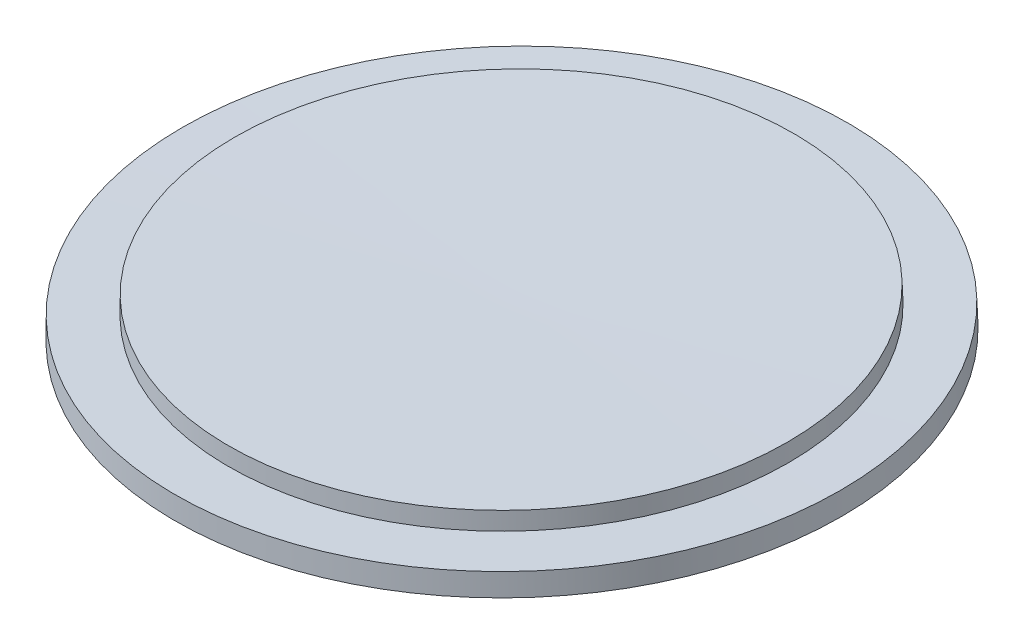
ISO-10303-21;
HEADER;
FILE_DESCRIPTION(('STEP AP214'),'2;1');
FILE_NAME('part.step','',(''),(''),'','','');
FILE_SCHEMA(('AUTOMOTIVE_DESIGN { 1 0 10303 214 1 1 1 1 }'));
ENDSEC;
DATA;
#1=APPLICATION_CONTEXT('core data for automotive mechanical design processes');
#2=APPLICATION_PROTOCOL_DEFINITION('international standard','automotive_design',2000,#1);
#3=PRODUCT_CONTEXT('',#1,'mechanical');
#4=PRODUCT('Part','Part','',(#3));
#5=PRODUCT_RELATED_PRODUCT_CATEGORY('part','',(#4));
#6=PRODUCT_DEFINITION_FORMATION('','',#4);
#7=PRODUCT_DEFINITION_CONTEXT('part definition',#1,'design');
#8=PRODUCT_DEFINITION('design','',#6,#7);
#9=PRODUCT_DEFINITION_SHAPE('','',#8);
#10=(LENGTH_UNIT() NAMED_UNIT(*) SI_UNIT(.MILLI.,.METRE.));
#11=(NAMED_UNIT(*) PLANE_ANGLE_UNIT() SI_UNIT($,.RADIAN.));
#12=(NAMED_UNIT(*) SI_UNIT($,.STERADIAN.) SOLID_ANGLE_UNIT());
#13=UNCERTAINTY_MEASURE_WITH_UNIT(LENGTH_MEASURE(1.E-05),#10,'distance_accuracy_value','');
#14=(GEOMETRIC_REPRESENTATION_CONTEXT(3) GLOBAL_UNCERTAINTY_ASSIGNED_CONTEXT((#13)) GLOBAL_UNIT_ASSIGNED_CONTEXT((#10,
#11,#12)) REPRESENTATION_CONTEXT('',''));
#15=CARTESIAN_POINT('',(0.,0.,0.));
#16=DIRECTION('',(0.,0.,1.));
#17=DIRECTION('',(1.,0.,0.));
#18=AXIS2_PLACEMENT_3D('',#15,#16,#17);
#19=CARTESIAN_POINT('',(608.159806789063,13.3703883650292,0.));
#20=DIRECTION('',(-0.0222407262017592,0.999752644456627,0.));
#21=DIRECTION('',(-0.999752644456627,-0.0222407262017592,0.));
#22=AXIS2_PLACEMENT_3D('',#19,#20,#21);
#23=CONICAL_SURFACE('',#22,601.166897327824,1.54855376662271);
#24=CARTESIAN_POINT('',(608.457247509512,0.,0.));
#25=VERTEX_POINT('',#24);
#26=VERTEX_LOOP('',#25);
#27=FACE_BOUND('',#26,.T.);
#28=CARTESIAN_POINT('',(608.159806789063,13.3703883650292,0.));
#29=DIRECTION('',(0.0222407262017592,-0.999752644456627,0.));
#30=DIRECTION('',(0.999752644456627,0.0222407262017592,0.));
#31=AXIS2_PLACEMENT_3D('',#28,#29,#30);
#32=CIRCLE('',#31,601.166897327824);
#33=CARTESIAN_POINT('',(1209.17800215234,26.7407767300585,0.));
#34=VERTEX_POINT('',#33);
#35=EDGE_CURVE('E67',#34,#34,#32,.T.);
#36=ORIENTED_EDGE('',*,*,#35,.T.);
#37=EDGE_LOOP('',(#36));
#38=FACE_BOUND('',#37,.T.);
#39=ADVANCED_FACE('F49',(#27,#38),#23,.T.);
#40=CARTESIAN_POINT('',(606.590384962578,83.9181576718018,0.));
#41=DIRECTION('',(-0.0222407262017592,0.999752644456627,0.));
#42=DIRECTION('',(-0.999752644456627,-0.0222407262017592,0.));
#43=AXIS2_PLACEMENT_3D('',#40,#41,#42);
#44=CONICAL_SURFACE('',#43,504.310439497787,1.54855376662271);
#45=CARTESIAN_POINT('',(606.839903791909,72.7019272662426,0.));
#46=VERTEX_POINT('',#45);
#47=VERTEX_LOOP('',#46);
#48=FACE_BOUND('',#47,.T.);
#49=CARTESIAN_POINT('',(606.590384962578,83.9181576718018,0.));
#50=DIRECTION('',(0.0222407262017592,-0.999752644456627,0.));
#51=DIRECTION('',(0.999752644456627,0.0222407262017592,0.));
#52=AXIS2_PLACEMENT_3D('',#49,#50,#51);
#53=CIRCLE('',#52,504.310439497787);
#54=CARTESIAN_POINT('',(1110.77608047757,95.1343880773609,0.));
#55=VERTEX_POINT('',#54);
#56=EDGE_CURVE('E13',#55,#55,#53,.T.);
#57=ORIENTED_EDGE('',*,*,#56,.F.);
#58=EDGE_LOOP('',(#57));
#59=FACE_BOUND('',#58,.T.);
#60=ADVANCED_FACE('F64',(#48,#59),#44,.F.);
#61=CARTESIAN_POINT('',(606.590384962578,83.9181576718018,0.));
#62=DIRECTION('',(0.0222407262017592,-0.999752644456627,0.));
#63=DIRECTION('',(0.999752644456627,0.0222407262017592,0.));
#64=AXIS2_PLACEMENT_3D('',#61,#62,#63);
#65=CONICAL_SURFACE('',#64,504.310439497787,0.02224256017219);
#66=CARTESIAN_POINT('',(607.30495709308,51.7971122237474,0.));
#67=DIRECTION('',(0.0222407262017592,-0.999752644456627,0.));
#68=DIRECTION('',(0.999752644456627,0.0222407262017592,0.));
#69=AXIS2_PLACEMENT_3D('',#66,#67,#68);
#70=CIRCLE('',#69,505.025188425399);
#71=CARTESIAN_POINT('',(1112.20522473858,63.0292391645085,0.));
#72=VERTEX_POINT('',#71);
#73=EDGE_CURVE('E56',#72,#72,#70,.T.);
#74=ORIENTED_EDGE('',*,*,#73,.F.);
#75=EDGE_LOOP('',(#74));
#76=FACE_BOUND('',#75,.T.);
#77=ORIENTED_EDGE('',*,*,#56,.T.);
#78=EDGE_LOOP('',(#77));
#79=FACE_BOUND('',#78,.T.);
#80=ADVANCED_FACE('F79',(#76,#79),#65,.T.);
#81=CARTESIAN_POINT('',(607.257835220874,53.9153081820213,0.));
#82=DIRECTION('',(-0.0222407262017592,0.999752644456627,0.));
#83=DIRECTION('',(-0.999752644456627,-0.0222407262017592,0.));
#84=AXIS2_PLACEMENT_3D('',#81,#82,#83);
#85=CONICAL_SURFACE('',#84,600.264702596767,1.54855376662271);
#86=ORIENTED_EDGE('',*,*,#73,.T.);
#87=EDGE_LOOP('',(#86));
#88=FACE_BOUND('',#87,.T.);
#89=CARTESIAN_POINT('',(607.257835220874,53.9153081820213,0.));
#90=DIRECTION('',(0.0222407262017592,-0.999752644456627,0.));
#91=DIRECTION('',(0.999752644456627,0.0222407262017592,0.));
#92=AXIS2_PLACEMENT_3D('',#89,#90,#91);
#93=CIRCLE('',#92,600.264702596767);
#94=CARTESIAN_POINT('',(1207.37405901596,67.2656310810564,0.));
#95=VERTEX_POINT('',#94);
#96=EDGE_CURVE('E69',#95,#95,#93,.T.);
#97=ORIENTED_EDGE('',*,*,#96,.F.);
#98=EDGE_LOOP('',(#97));
#99=FACE_BOUND('',#98,.T.);
#100=ADVANCED_FACE('F76',(#88,#99),#85,.F.);
#101=CARTESIAN_POINT('',(607.257835220874,53.9153081820213,0.));
#102=DIRECTION('',(0.0222407262017592,-0.999752644456627,0.));
#103=DIRECTION('',(0.999752644456627,0.0222407262017592,0.));
#104=AXIS2_PLACEMENT_3D('',#101,#102,#103);
#105=CONICAL_SURFACE('',#104,600.264702596767,0.022242560172189);
#106=ORIENTED_EDGE('',*,*,#35,.F.);
#107=EDGE_LOOP('',(#106));
#108=FACE_BOUND('',#107,.T.);
#109=ORIENTED_EDGE('',*,*,#96,.T.);
#110=EDGE_LOOP('',(#109));
#111=FACE_BOUND('',#110,.T.);
#112=ADVANCED_FACE('F91',(#108,#111),#105,.T.);
#113=CLOSED_SHELL('',(#39,#60,#80,#100,#112));
#114=MANIFOLD_SOLID_BREP('B2',#113);
#115=ADVANCED_BREP_SHAPE_REPRESENTATION('',(#18,#114),#14);
#116=SHAPE_DEFINITION_REPRESENTATION(#9,#115);
ENDSEC;
END-ISO-10303-21;
